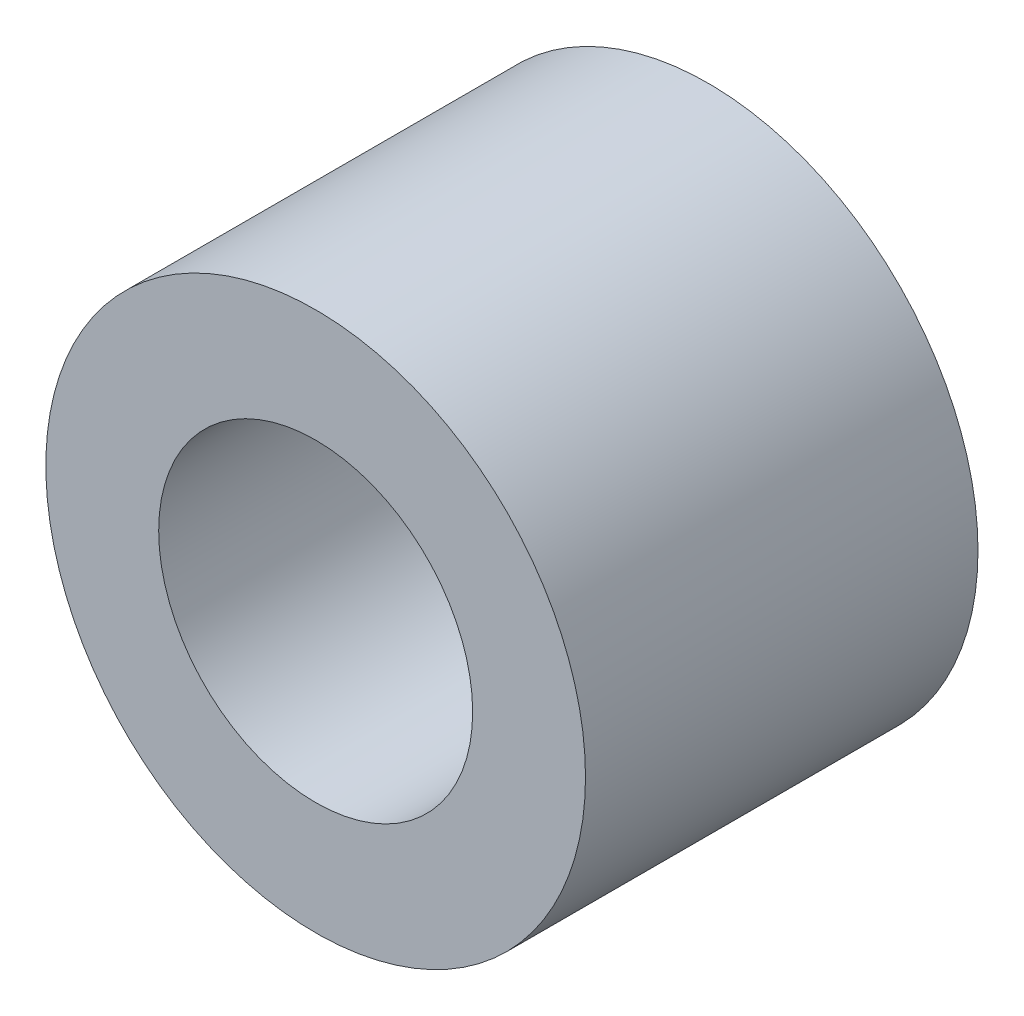
ISO-10303-21;
HEADER;
FILE_DESCRIPTION(('STEP AP214'),'2;1');
FILE_NAME('part.step','',(''),(''),'','','');
FILE_SCHEMA(('AUTOMOTIVE_DESIGN { 1 0 10303 214 1 1 1 1 }'));
ENDSEC;
DATA;
#1=APPLICATION_CONTEXT('core data for automotive mechanical design processes');
#2=APPLICATION_PROTOCOL_DEFINITION('international standard','automotive_design',2000,#1);
#3=PRODUCT_CONTEXT('',#1,'mechanical');
#4=PRODUCT('Part','Part','',(#3));
#5=PRODUCT_RELATED_PRODUCT_CATEGORY('part','',(#4));
#6=PRODUCT_DEFINITION_FORMATION('','',#4);
#7=PRODUCT_DEFINITION_CONTEXT('part definition',#1,'design');
#8=PRODUCT_DEFINITION('design','',#6,#7);
#9=PRODUCT_DEFINITION_SHAPE('','',#8);
#10=(LENGTH_UNIT() NAMED_UNIT(*) SI_UNIT(.MILLI.,.METRE.));
#11=(NAMED_UNIT(*) PLANE_ANGLE_UNIT() SI_UNIT($,.RADIAN.));
#12=(NAMED_UNIT(*) SI_UNIT($,.STERADIAN.) SOLID_ANGLE_UNIT());
#13=UNCERTAINTY_MEASURE_WITH_UNIT(LENGTH_MEASURE(1.E-05),#10,'distance_accuracy_value','');
#14=(GEOMETRIC_REPRESENTATION_CONTEXT(3) GLOBAL_UNCERTAINTY_ASSIGNED_CONTEXT((#13)) GLOBAL_UNIT_ASSIGNED_CONTEXT((#10,
#11,#12)) REPRESENTATION_CONTEXT('',''));
#15=CARTESIAN_POINT('',(0.,0.,0.));
#16=DIRECTION('',(0.,0.,1.));
#17=DIRECTION('',(1.,0.,0.));
#18=AXIS2_PLACEMENT_3D('',#15,#16,#17);
#19=CARTESIAN_POINT('',(0.,0.,4.));
#20=DIRECTION('',(0.,0.,1.));
#21=DIRECTION('',(1.,0.,0.));
#22=AXIS2_PLACEMENT_3D('',#19,#20,#21);
#23=PLANE('',#22);
#24=CARTESIAN_POINT('',(0.,0.,4.));
#25=DIRECTION('',(0.,0.,1.));
#26=DIRECTION('',(1.,0.,0.));
#27=AXIS2_PLACEMENT_3D('',#24,#25,#26);
#28=CIRCLE('',#27,2.75);
#29=CARTESIAN_POINT('',(2.75,0.,4.));
#30=VERTEX_POINT('',#29);
#31=EDGE_CURVE('E10',#30,#30,#28,.T.);
#32=ORIENTED_EDGE('',*,*,#31,.T.);
#33=EDGE_LOOP('',(#32));
#34=FACE_BOUND('',#33,.T.);
#35=CARTESIAN_POINT('',(0.,0.,4.));
#36=DIRECTION('',(0.,0.,1.));
#37=DIRECTION('',(1.,0.,0.));
#38=AXIS2_PLACEMENT_3D('',#35,#36,#37);
#39=CIRCLE('',#38,1.6);
#40=CARTESIAN_POINT('',(1.6,0.,4.));
#41=VERTEX_POINT('',#40);
#42=EDGE_CURVE('E46',#41,#41,#39,.T.);
#43=ORIENTED_EDGE('',*,*,#42,.F.);
#44=EDGE_LOOP('',(#43));
#45=FACE_BOUND('',#44,.T.);
#46=ADVANCED_FACE('F35',(#34,#45),#23,.T.);
#47=CARTESIAN_POINT('',(0.,0.,0.));
#48=DIRECTION('',(0.,0.,1.));
#49=DIRECTION('',(1.,0.,0.));
#50=AXIS2_PLACEMENT_3D('',#47,#48,#49);
#51=PLANE('',#50);
#52=CARTESIAN_POINT('',(0.,0.,0.));
#53=DIRECTION('',(0.,0.,1.));
#54=DIRECTION('',(1.,0.,0.));
#55=AXIS2_PLACEMENT_3D('',#52,#53,#54);
#56=CIRCLE('',#55,2.75);
#57=CARTESIAN_POINT('',(2.75,0.,0.));
#58=VERTEX_POINT('',#57);
#59=EDGE_CURVE('E39',#58,#58,#56,.T.);
#60=ORIENTED_EDGE('',*,*,#59,.F.);
#61=EDGE_LOOP('',(#60));
#62=FACE_BOUND('',#61,.T.);
#63=CARTESIAN_POINT('',(0.,0.,0.));
#64=DIRECTION('',(0.,0.,1.));
#65=DIRECTION('',(1.,0.,0.));
#66=AXIS2_PLACEMENT_3D('',#63,#64,#65);
#67=CIRCLE('',#66,1.6);
#68=CARTESIAN_POINT('',(1.6,0.,0.));
#69=VERTEX_POINT('',#68);
#70=EDGE_CURVE('E48',#69,#69,#67,.T.);
#71=ORIENTED_EDGE('',*,*,#70,.T.);
#72=EDGE_LOOP('',(#71));
#73=FACE_BOUND('',#72,.T.);
#74=ADVANCED_FACE('F58',(#62,#73),#51,.F.);
#75=CARTESIAN_POINT('',(0.,0.,4.));
#76=DIRECTION('',(0.,0.,-1.));
#77=DIRECTION('',(-1.,0.,0.));
#78=AXIS2_PLACEMENT_3D('',#75,#76,#77);
#79=CYLINDRICAL_SURFACE('',#78,2.75);
#80=ORIENTED_EDGE('',*,*,#31,.F.);
#81=EDGE_LOOP('',(#80));
#82=FACE_BOUND('',#81,.T.);
#83=ORIENTED_EDGE('',*,*,#59,.T.);
#84=EDGE_LOOP('',(#83));
#85=FACE_BOUND('',#84,.T.);
#86=ADVANCED_FACE('F37',(#82,#85),#79,.T.);
#87=CARTESIAN_POINT('',(0.,0.,4.));
#88=DIRECTION('',(0.,0.,-1.));
#89=DIRECTION('',(-1.,0.,0.));
#90=AXIS2_PLACEMENT_3D('',#87,#88,#89);
#91=CYLINDRICAL_SURFACE('',#90,1.6);
#92=ORIENTED_EDGE('',*,*,#42,.T.);
#93=EDGE_LOOP('',(#92));
#94=FACE_BOUND('',#93,.T.);
#95=ORIENTED_EDGE('',*,*,#70,.F.);
#96=EDGE_LOOP('',(#95));
#97=FACE_BOUND('',#96,.T.);
#98=ADVANCED_FACE('F54',(#94,#97),#91,.F.);
#99=CLOSED_SHELL('',(#46,#74,#86,#98));
#100=MANIFOLD_SOLID_BREP('B2',#99);
#101=ADVANCED_BREP_SHAPE_REPRESENTATION('',(#18,#100),#14);
#102=SHAPE_DEFINITION_REPRESENTATION(#9,#101);
ENDSEC;
END-ISO-10303-21;
